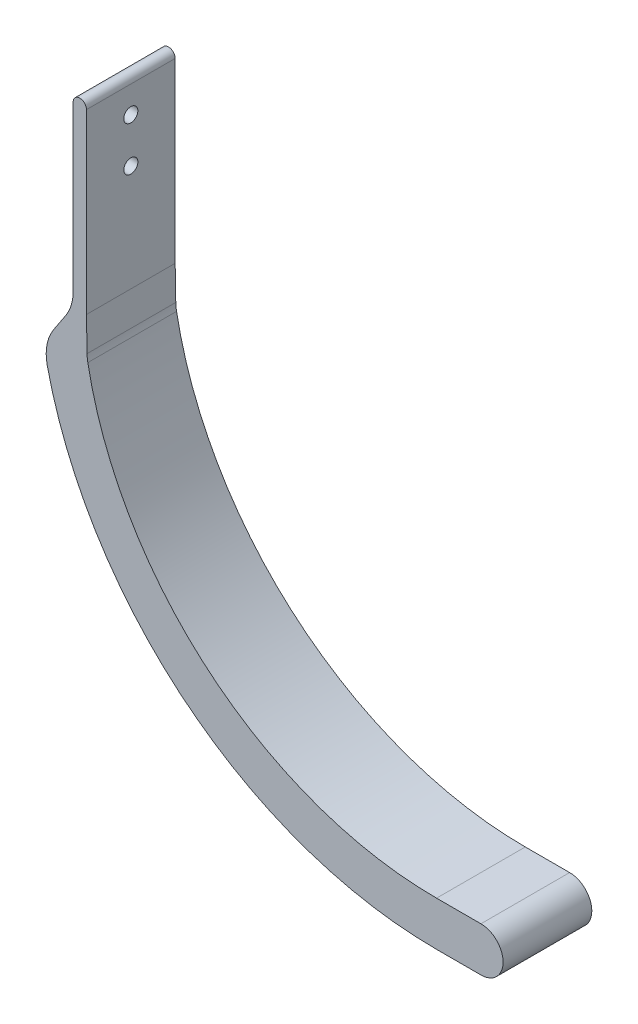
ISO-10303-21;
HEADER;
FILE_DESCRIPTION(('STEP AP214'),'2;1');
FILE_NAME('part.step','',(''),(''),'','','');
FILE_SCHEMA(('AUTOMOTIVE_DESIGN { 1 0 10303 214 1 1 1 1 }'));
ENDSEC;
DATA;
#1=APPLICATION_CONTEXT('core data for automotive mechanical design processes');
#2=APPLICATION_PROTOCOL_DEFINITION('international standard','automotive_design',2000,#1);
#3=PRODUCT_CONTEXT('',#1,'mechanical');
#4=PRODUCT('Part','Part','',(#3));
#5=PRODUCT_RELATED_PRODUCT_CATEGORY('part','',(#4));
#6=PRODUCT_DEFINITION_FORMATION('','',#4);
#7=PRODUCT_DEFINITION_CONTEXT('part definition',#1,'design');
#8=PRODUCT_DEFINITION('design','',#6,#7);
#9=PRODUCT_DEFINITION_SHAPE('','',#8);
#10=(LENGTH_UNIT() NAMED_UNIT(*) SI_UNIT(.MILLI.,.METRE.));
#11=(NAMED_UNIT(*) PLANE_ANGLE_UNIT() SI_UNIT($,.RADIAN.));
#12=(NAMED_UNIT(*) SI_UNIT($,.STERADIAN.) SOLID_ANGLE_UNIT());
#13=UNCERTAINTY_MEASURE_WITH_UNIT(LENGTH_MEASURE(1.E-05),#10,'distance_accuracy_value','');
#14=(GEOMETRIC_REPRESENTATION_CONTEXT(3) GLOBAL_UNCERTAINTY_ASSIGNED_CONTEXT((#13)) GLOBAL_UNIT_ASSIGNED_CONTEXT((#10,
#11,#12)) REPRESENTATION_CONTEXT('',''));
#15=CARTESIAN_POINT('',(0.,0.,0.));
#16=DIRECTION('',(0.,0.,1.));
#17=DIRECTION('',(1.,0.,0.));
#18=AXIS2_PLACEMENT_3D('',#15,#16,#17);
#19=CARTESIAN_POINT('',(-42.2497072792991,-138.569783033541,0.));
#20=DIRECTION('',(0.,0.,1.));
#21=DIRECTION('',(1.,0.,0.));
#22=AXIS2_PLACEMENT_3D('',#19,#20,#21);
#23=CYLINDRICAL_SURFACE('',#22,80.);
#24=CARTESIAN_POINT('',(-42.2497072792991,-138.569783033541,0.));
#25=DIRECTION('',(0.,0.,-1.));
#26=DIRECTION('',(-1.,0.,0.));
#27=AXIS2_PLACEMENT_3D('',#24,#25,#26);
#28=CIRCLE('',#27,80.);
#29=CARTESIAN_POINT('',(-42.2497072792991,-218.56978303354,0.));
#30=VERTEX_POINT('',#29);
#31=CARTESIAN_POINT('',(-120.879349349605,-153.313574536934,0.));
#32=VERTEX_POINT('',#31);
#33=EDGE_CURVE('E140',#30,#32,#28,.T.);
#34=ORIENTED_EDGE('',*,*,#33,.T.);
#35=DIRECTION('',(0.,0.,1.));
#36=VECTOR('',#35,1.);
#37=CARTESIAN_POINT('',(-120.879349349605,-153.313574536934,0.));
#38=LINE('',#37,#36);
#39=CARTESIAN_POINT('',(-120.879349349605,-153.313574536934,20.));
#40=VERTEX_POINT('',#39);
#41=EDGE_CURVE('E202',#32,#40,#38,.T.);
#42=ORIENTED_EDGE('',*,*,#41,.T.);
#43=CARTESIAN_POINT('',(-42.2497072792991,-138.569783033541,20.));
#44=DIRECTION('',(0.,0.,-1.));
#45=DIRECTION('',(-1.,0.,0.));
#46=AXIS2_PLACEMENT_3D('',#43,#44,#45);
#47=CIRCLE('',#46,80.);
#48=CARTESIAN_POINT('',(-42.2497072792991,-218.56978303354,20.));
#49=VERTEX_POINT('',#48);
#50=EDGE_CURVE('E173',#49,#40,#47,.T.);
#51=ORIENTED_EDGE('',*,*,#50,.F.);
#52=DIRECTION('',(0.,0.,1.));
#53=VECTOR('',#52,1.);
#54=CARTESIAN_POINT('',(-42.2497072792991,-218.56978303354,0.));
#55=LINE('',#54,#53);
#56=EDGE_CURVE('E200',#30,#49,#55,.T.);
#57=ORIENTED_EDGE('',*,*,#56,.F.);
#58=EDGE_LOOP('',(#34,#42,#51,#57));
#59=FACE_BOUND('',#58,.T.);
#60=ADVANCED_FACE('F33',(#59),#23,.F.);
#61=CARTESIAN_POINT('',(-32.249707279299,-218.56978303354,0.));
#62=DIRECTION('',(0.,1.,0.));
#63=DIRECTION('',(0.,0.,1.));
#64=AXIS2_PLACEMENT_3D('',#61,#62,#63);
#65=PLANE('',#64);
#66=DIRECTION('',(-1.,0.,0.));
#67=VECTOR('',#66,1.);
#68=CARTESIAN_POINT('',(-32.249707279299,-218.56978303354,20.));
#69=LINE('',#68,#67);
#70=CARTESIAN_POINT('',(-32.249707279299,-218.56978303354,20.));
#71=VERTEX_POINT('',#70);
#72=EDGE_CURVE('E197',#71,#49,#69,.T.);
#73=ORIENTED_EDGE('',*,*,#72,.F.);
#74=DIRECTION('',(0.,0.,1.));
#75=VECTOR('',#74,1.);
#76=CARTESIAN_POINT('',(-32.249707279299,-218.56978303354,0.));
#77=LINE('',#76,#75);
#78=CARTESIAN_POINT('',(-32.249707279299,-218.56978303354,0.));
#79=VERTEX_POINT('',#78);
#80=EDGE_CURVE('E203',#79,#71,#77,.T.);
#81=ORIENTED_EDGE('',*,*,#80,.F.);
#82=DIRECTION('',(-1.,0.,0.));
#83=VECTOR('',#82,1.);
#84=CARTESIAN_POINT('',(-32.249707279299,-218.56978303354,0.));
#85=LINE('',#84,#83);
#86=EDGE_CURVE('E148',#79,#30,#85,.T.);
#87=ORIENTED_EDGE('',*,*,#86,.T.);
#88=ORIENTED_EDGE('',*,*,#56,.T.);
#89=EDGE_LOOP('',(#73,#81,#87,#88));
#90=FACE_BOUND('',#89,.T.);
#91=ADVANCED_FACE('F288',(#90),#65,.T.);
#92=CARTESIAN_POINT('',(-32.249707279299,-223.56978303354,0.));
#93=DIRECTION('',(0.,0.,1.));
#94=DIRECTION('',(1.,0.,0.));
#95=AXIS2_PLACEMENT_3D('',#92,#93,#94);
#96=CYLINDRICAL_SURFACE('',#95,5.);
#97=CARTESIAN_POINT('',(-32.249707279299,-223.56978303354,20.));
#98=DIRECTION('',(0.,0.,1.));
#99=DIRECTION('',(1.,0.,0.));
#100=AXIS2_PLACEMENT_3D('',#97,#98,#99);
#101=CIRCLE('',#100,5.);
#102=CARTESIAN_POINT('',(-32.249707279299,-228.56978303354,20.));
#103=VERTEX_POINT('',#102);
#104=EDGE_CURVE('E194',#103,#71,#101,.T.);
#105=ORIENTED_EDGE('',*,*,#104,.F.);
#106=DIRECTION('',(0.,0.,1.));
#107=VECTOR('',#106,1.);
#108=CARTESIAN_POINT('',(-32.249707279299,-228.56978303354,0.));
#109=LINE('',#108,#107);
#110=CARTESIAN_POINT('',(-32.249707279299,-228.56978303354,0.));
#111=VERTEX_POINT('',#110);
#112=EDGE_CURVE('E205',#111,#103,#109,.T.);
#113=ORIENTED_EDGE('',*,*,#112,.F.);
#114=CARTESIAN_POINT('',(-32.249707279299,-223.56978303354,0.));
#115=DIRECTION('',(0.,0.,1.));
#116=DIRECTION('',(1.,0.,0.));
#117=AXIS2_PLACEMENT_3D('',#114,#115,#116);
#118=CIRCLE('',#117,5.);
#119=EDGE_CURVE('E168',#111,#79,#118,.T.);
#120=ORIENTED_EDGE('',*,*,#119,.T.);
#121=ORIENTED_EDGE('',*,*,#80,.T.);
#122=EDGE_LOOP('',(#105,#113,#120,#121));
#123=FACE_BOUND('',#122,.T.);
#124=ADVANCED_FACE('F293',(#123),#96,.T.);
#125=CARTESIAN_POINT('',(-42.2497072792991,-228.56978303354,0.));
#126=DIRECTION('',(0.,-1.,0.));
#127=DIRECTION('',(0.,0.,-1.));
#128=AXIS2_PLACEMENT_3D('',#125,#126,#127);
#129=PLANE('',#128);
#130=DIRECTION('',(1.,0.,0.));
#131=VECTOR('',#130,1.);
#132=CARTESIAN_POINT('',(-42.2497072792991,-228.56978303354,20.));
#133=LINE('',#132,#131);
#134=CARTESIAN_POINT('',(-42.2497072792991,-228.569783033541,20.));
#135=VERTEX_POINT('',#134);
#136=EDGE_CURVE('E191',#135,#103,#133,.T.);
#137=ORIENTED_EDGE('',*,*,#136,.F.);
#138=DIRECTION('',(0.,0.,1.));
#139=VECTOR('',#138,1.);
#140=CARTESIAN_POINT('',(-42.2497072792991,-228.569783033541,0.));
#141=LINE('',#140,#139);
#142=CARTESIAN_POINT('',(-42.2497072792991,-228.569783033541,0.));
#143=VERTEX_POINT('',#142);
#144=EDGE_CURVE('E207',#143,#135,#141,.T.);
#145=ORIENTED_EDGE('',*,*,#144,.F.);
#146=DIRECTION('',(1.,0.,0.));
#147=VECTOR('',#146,1.);
#148=CARTESIAN_POINT('',(-42.2497072792991,-228.56978303354,0.));
#149=LINE('',#148,#147);
#150=EDGE_CURVE('E165',#143,#111,#149,.T.);
#151=ORIENTED_EDGE('',*,*,#150,.T.);
#152=ORIENTED_EDGE('',*,*,#112,.T.);
#153=EDGE_LOOP('',(#137,#145,#151,#152));
#154=FACE_BOUND('',#153,.T.);
#155=ADVANCED_FACE('F312',(#154),#129,.T.);
#156=CARTESIAN_POINT('',(-42.2497072792991,-138.569783033541,0.));
#157=DIRECTION('',(0.,0.,1.));
#158=DIRECTION('',(1.,0.,0.));
#159=AXIS2_PLACEMENT_3D('',#156,#157,#158);
#160=CYLINDRICAL_SURFACE('',#159,90.);
#161=CARTESIAN_POINT('',(-42.2497072792991,-138.569783033541,20.));
#162=DIRECTION('',(0.,0.,1.));
#163=DIRECTION('',(1.,0.,0.));
#164=AXIS2_PLACEMENT_3D('',#161,#162,#163);
#165=CIRCLE('',#164,90.);
#166=CARTESIAN_POINT('',(-130.017899018848,-158.488229729248,20.));
#167=VERTEX_POINT('',#166);
#168=EDGE_CURVE('E189',#167,#135,#165,.T.);
#169=ORIENTED_EDGE('',*,*,#168,.F.);
#170=DIRECTION('',(0.,0.,1.));
#171=VECTOR('',#170,1.);
#172=CARTESIAN_POINT('',(-130.017899018848,-158.488229729248,0.));
#173=LINE('',#172,#171);
#174=CARTESIAN_POINT('',(-130.017899018848,-158.488229729248,0.));
#175=VERTEX_POINT('',#174);
#176=EDGE_CURVE('E54',#167,#175,#173,.F.);
#177=ORIENTED_EDGE('',*,*,#176,.T.);
#178=CARTESIAN_POINT('',(-42.2497072792991,-138.569783033541,0.));
#179=DIRECTION('',(0.,0.,1.));
#180=DIRECTION('',(1.,0.,0.));
#181=AXIS2_PLACEMENT_3D('',#178,#179,#180);
#182=CIRCLE('',#181,90.);
#183=EDGE_CURVE('E163',#175,#143,#182,.T.);
#184=ORIENTED_EDGE('',*,*,#183,.T.);
#185=ORIENTED_EDGE('',*,*,#144,.T.);
#186=EDGE_LOOP('',(#169,#177,#184,#185));
#187=FACE_BOUND('',#186,.T.);
#188=ADVANCED_FACE('F309',(#187),#160,.T.);
#189=CARTESIAN_POINT('',(-124.186249990153,-144.07769420766,0.));
#190=DIRECTION('',(-0.833977139443532,0.551798995002332,0.));
#191=DIRECTION('',(-0.551798995002332,-0.833977139443532,0.));
#192=AXIS2_PLACEMENT_3D('',#189,#190,#191);
#193=PLANE('',#192);
#194=DIRECTION('',(-0.551798995002332,-0.833977139443532,0.));
#195=VECTOR('',#194,1.);
#196=CARTESIAN_POINT('',(-124.186249990153,-144.07769420766,0.));
#197=LINE('',#196,#195);
#198=CARTESIAN_POINT('',(-125.846478595718,-146.58692803344,0.));
#199=VERTEX_POINT('',#198);
#200=CARTESIAN_POINT('',(-128.605649108889,-150.757079035258,0.));
#201=VERTEX_POINT('',#200);
#202=EDGE_CURVE('E160',#199,#201,#197,.T.);
#203=ORIENTED_EDGE('',*,*,#202,.T.);
#204=DIRECTION('',(0.,0.,1.));
#205=VECTOR('',#204,1.);
#206=CARTESIAN_POINT('',(-128.605649108889,-150.757079035258,0.));
#207=LINE('',#206,#205);
#208=CARTESIAN_POINT('',(-128.605649108889,-150.757079035258,20.));
#209=VERTEX_POINT('',#208);
#210=EDGE_CURVE('E218',#201,#209,#207,.T.);
#211=ORIENTED_EDGE('',*,*,#210,.T.);
#212=DIRECTION('',(-0.551798995002332,-0.833977139443532,0.));
#213=VECTOR('',#212,1.);
#214=CARTESIAN_POINT('',(-124.186249990153,-144.07769420766,20.));
#215=LINE('',#214,#213);
#216=CARTESIAN_POINT('',(-125.846478595718,-146.58692803344,20.));
#217=VERTEX_POINT('',#216);
#218=EDGE_CURVE('E186',#217,#209,#215,.T.);
#219=ORIENTED_EDGE('',*,*,#218,.F.);
#220=DIRECTION('',(0.,0.,1.));
#221=VECTOR('',#220,1.);
#222=CARTESIAN_POINT('',(-125.846478595718,-146.58692803344,0.));
#223=LINE('',#222,#221);
#224=EDGE_CURVE('E216',#217,#199,#223,.F.);
#225=ORIENTED_EDGE('',*,*,#224,.T.);
#226=EDGE_LOOP('',(#203,#211,#219,#225));
#227=FACE_BOUND('',#226,.T.);
#228=ADVANCED_FACE('F240',(#227),#193,.T.);
#229=CARTESIAN_POINT('',(-124.186249990154,-104.07769420766,0.));
#230=DIRECTION('',(-1.,0.,0.));
#231=DIRECTION('',(0.,-1.,0.));
#232=AXIS2_PLACEMENT_3D('',#229,#230,#231);
#233=PLANE('',#232);
#234=CARTESIAN_POINT('',(-124.186249990154,-120.07769420766,10.));
#235=DIRECTION('',(-1.,0.,0.));
#236=DIRECTION('',(0.,-1.,0.));
#237=AXIS2_PLACEMENT_3D('',#234,#235,#236);
#238=CIRCLE('',#237,1.58749999999999);
#239=CARTESIAN_POINT('',(-124.186249990154,-121.66519420766,10.));
#240=VERTEX_POINT('',#239);
#241=EDGE_CURVE('E261',#240,#240,#238,.T.);
#242=ORIENTED_EDGE('',*,*,#241,.F.);
#243=EDGE_LOOP('',(#242));
#244=FACE_BOUND('',#243,.T.);
#245=CARTESIAN_POINT('',(-124.186249990154,-110.07769420766,10.));
#246=DIRECTION('',(-1.,0.,0.));
#247=DIRECTION('',(0.,-1.,0.));
#248=AXIS2_PLACEMENT_3D('',#245,#246,#247);
#249=CIRCLE('',#248,1.58749999999999);
#250=CARTESIAN_POINT('',(-124.186249990154,-111.66519420766,10.));
#251=VERTEX_POINT('',#250);
#252=EDGE_CURVE('E177',#251,#251,#249,.T.);
#253=ORIENTED_EDGE('',*,*,#252,.F.);
#254=EDGE_LOOP('',(#253));
#255=FACE_BOUND('',#254,.T.);
#256=DIRECTION('',(0.,-1.,0.));
#257=VECTOR('',#256,1.);
#258=CARTESIAN_POINT('',(-124.186249990154,-104.07769420766,0.));
#259=LINE('',#258,#257);
#260=CARTESIAN_POINT('',(-124.186249990154,-104.07769420766,0.));
#261=VERTEX_POINT('',#260);
#262=CARTESIAN_POINT('',(-124.186249990154,-141.068938083416,0.));
#263=VERTEX_POINT('',#262);
#264=EDGE_CURVE('E155',#261,#263,#259,.T.);
#265=ORIENTED_EDGE('',*,*,#264,.T.);
#266=DIRECTION('',(0.,0.,1.));
#267=VECTOR('',#266,1.);
#268=CARTESIAN_POINT('',(-124.186249990154,-141.068938083416,20.));
#269=LINE('',#268,#267);
#270=CARTESIAN_POINT('',(-124.186249990154,-141.068938083416,20.));
#271=VERTEX_POINT('',#270);
#272=EDGE_CURVE('E226',#263,#271,#269,.T.);
#273=ORIENTED_EDGE('',*,*,#272,.T.);
#274=DIRECTION('',(0.,-1.,0.));
#275=VECTOR('',#274,1.);
#276=CARTESIAN_POINT('',(-124.186249990154,-104.07769420766,20.));
#277=LINE('',#276,#275);
#278=CARTESIAN_POINT('',(-124.186249990154,-104.07769420766,20.));
#279=VERTEX_POINT('',#278);
#280=EDGE_CURVE('E183',#279,#271,#277,.T.);
#281=ORIENTED_EDGE('',*,*,#280,.F.);
#282=DIRECTION('',(0.,0.,1.));
#283=VECTOR('',#282,1.);
#284=CARTESIAN_POINT('',(-124.186249990154,-104.07769420766,0.));
#285=LINE('',#284,#283);
#286=EDGE_CURVE('E210',#261,#279,#285,.T.);
#287=ORIENTED_EDGE('',*,*,#286,.F.);
#288=EDGE_LOOP('',(#265,#273,#281,#287));
#289=FACE_BOUND('',#288,.T.);
#290=ADVANCED_FACE('F243',(#244,#255,#289),#233,.T.);
#291=CARTESIAN_POINT('',(-122.686249990154,-104.07769420766,0.));
#292=DIRECTION('',(0.,0.,1.));
#293=DIRECTION('',(1.,0.,0.));
#294=AXIS2_PLACEMENT_3D('',#291,#292,#293);
#295=CYLINDRICAL_SURFACE('',#294,1.5);
#296=CARTESIAN_POINT('',(-122.686249990154,-104.07769420766,20.));
#297=DIRECTION('',(0.,0.,1.));
#298=DIRECTION('',(1.,0.,0.));
#299=AXIS2_PLACEMENT_3D('',#296,#297,#298);
#300=CIRCLE('',#299,1.5);
#301=CARTESIAN_POINT('',(-121.186249990154,-104.07769420766,20.));
#302=VERTEX_POINT('',#301);
#303=EDGE_CURVE('E180',#302,#279,#300,.T.);
#304=ORIENTED_EDGE('',*,*,#303,.F.);
#305=DIRECTION('',(0.,0.,1.));
#306=VECTOR('',#305,1.);
#307=CARTESIAN_POINT('',(-121.186249990154,-104.07769420766,0.));
#308=LINE('',#307,#306);
#309=CARTESIAN_POINT('',(-121.186249990154,-104.07769420766,0.));
#310=VERTEX_POINT('',#309);
#311=EDGE_CURVE('E147',#310,#302,#308,.T.);
#312=ORIENTED_EDGE('',*,*,#311,.F.);
#313=CARTESIAN_POINT('',(-122.686249990154,-104.07769420766,0.));
#314=DIRECTION('',(0.,0.,1.));
#315=DIRECTION('',(1.,0.,0.));
#316=AXIS2_PLACEMENT_3D('',#313,#314,#315);
#317=CIRCLE('',#316,1.5);
#318=EDGE_CURVE('E153',#310,#261,#317,.T.);
#319=ORIENTED_EDGE('',*,*,#318,.T.);
#320=ORIENTED_EDGE('',*,*,#286,.T.);
#321=EDGE_LOOP('',(#304,#312,#319,#320));
#322=FACE_BOUND('',#321,.T.);
#323=ADVANCED_FACE('F246',(#322),#295,.T.);
#324=CARTESIAN_POINT('',(-121.186249990154,-144.07769420766,0.));
#325=DIRECTION('',(1.,0.,0.));
#326=DIRECTION('',(0.,1.,0.));
#327=AXIS2_PLACEMENT_3D('',#324,#325,#326);
#328=PLANE('',#327);
#329=CARTESIAN_POINT('',(-121.186249990154,-120.07769420766,10.));
#330=DIRECTION('',(1.,0.,0.));
#331=DIRECTION('',(0.,0.,-1.));
#332=AXIS2_PLACEMENT_3D('',#329,#330,#331);
#333=CIRCLE('',#332,1.58749999999999);
#334=CARTESIAN_POINT('',(-121.186249990154,-120.07769420766,8.41250000000001));
#335=VERTEX_POINT('',#334);
#336=EDGE_CURVE('E264',#335,#335,#333,.T.);
#337=ORIENTED_EDGE('',*,*,#336,.F.);
#338=EDGE_LOOP('',(#337));
#339=FACE_BOUND('',#338,.T.);
#340=CARTESIAN_POINT('',(-121.186249990154,-110.07769420766,10.));
#341=DIRECTION('',(1.,0.,0.));
#342=DIRECTION('',(0.,0.,-1.));
#343=AXIS2_PLACEMENT_3D('',#340,#341,#342);
#344=CIRCLE('',#343,1.58749999999999);
#345=CARTESIAN_POINT('',(-121.186249990154,-110.07769420766,8.41250000000001));
#346=VERTEX_POINT('',#345);
#347=EDGE_CURVE('E258',#346,#346,#344,.T.);
#348=ORIENTED_EDGE('',*,*,#347,.F.);
#349=EDGE_LOOP('',(#348));
#350=FACE_BOUND('',#349,.T.);
#351=DIRECTION('',(0.,1.,0.));
#352=VECTOR('',#351,1.);
#353=CARTESIAN_POINT('',(-121.186249990154,-144.07769420766,20.));
#354=LINE('',#353,#352);
#355=CARTESIAN_POINT('',(-121.186249990154,-144.07769420766,20.));
#356=VERTEX_POINT('',#355);
#357=EDGE_CURVE('E146',#356,#302,#354,.T.);
#358=ORIENTED_EDGE('',*,*,#357,.F.);
#359=DIRECTION('',(0.,0.,1.));
#360=VECTOR('',#359,1.);
#361=CARTESIAN_POINT('',(-121.186249990154,-144.07769420766,0.));
#362=LINE('',#361,#360);
#363=CARTESIAN_POINT('',(-121.186249990154,-144.07769420766,0.));
#364=VERTEX_POINT('',#363);
#365=EDGE_CURVE('E133',#364,#356,#362,.T.);
#366=ORIENTED_EDGE('',*,*,#365,.F.);
#367=DIRECTION('',(0.,1.,0.));
#368=VECTOR('',#367,1.);
#369=CARTESIAN_POINT('',(-121.186249990154,-144.07769420766,0.));
#370=LINE('',#369,#368);
#371=EDGE_CURVE('E139',#364,#310,#370,.T.);
#372=ORIENTED_EDGE('',*,*,#371,.T.);
#373=ORIENTED_EDGE('',*,*,#311,.T.);
#374=EDGE_LOOP('',(#358,#366,#372,#373));
#375=FACE_BOUND('',#374,.T.);
#376=ADVANCED_FACE('F144',(#339,#350,#375),#328,.T.);
#377=CARTESIAN_POINT('',(-121.034327520276,-152.461637246895,0.));
#378=DIRECTION('',(0.999835861502363,0.0181176724175101,0.));
#379=DIRECTION('',(-0.0181176724175101,0.999835861502363,0.));
#380=AXIS2_PLACEMENT_3D('',#377,#378,#379);
#381=PLANE('',#380);
#382=DIRECTION('',(-0.0181176724175101,0.999835861502363,0.));
#383=VECTOR('',#382,1.);
#384=CARTESIAN_POINT('',(-121.034327520276,-152.461637246895,20.));
#385=LINE('',#384,#383);
#386=CARTESIAN_POINT('',(-121.04900270584,-151.651777323185,20.));
#387=VERTEX_POINT('',#386);
#388=EDGE_CURVE('E176',#387,#356,#385,.T.);
#389=ORIENTED_EDGE('',*,*,#388,.F.);
#390=DIRECTION('',(0.,0.,-1.));
#391=VECTOR('',#390,1.);
#392=CARTESIAN_POINT('',(-121.04900270584,-151.651777323185,0.));
#393=LINE('',#392,#391);
#394=CARTESIAN_POINT('',(-121.04900270584,-151.651777323185,0.));
#395=VERTEX_POINT('',#394);
#396=EDGE_CURVE('E136',#387,#395,#393,.T.);
#397=ORIENTED_EDGE('',*,*,#396,.T.);
#398=DIRECTION('',(-0.0181176724175101,0.999835861502363,0.));
#399=VECTOR('',#398,1.);
#400=CARTESIAN_POINT('',(-121.034327520276,-152.461637246895,0.));
#401=LINE('',#400,#399);
#402=EDGE_CURVE('E129',#395,#364,#401,.T.);
#403=ORIENTED_EDGE('',*,*,#402,.T.);
#404=ORIENTED_EDGE('',*,*,#365,.T.);
#405=EDGE_LOOP('',(#389,#397,#403,#404));
#406=FACE_BOUND('',#405,.T.);
#407=ADVANCED_FACE('F132',(#406),#381,.T.);
#408=CARTESIAN_POINT('',(-42.2497072792991,-138.569783033541,0.));
#409=DIRECTION('',(0.,0.,-1.));
#410=DIRECTION('',(-1.,0.,0.));
#411=AXIS2_PLACEMENT_3D('',#408,#409,#410);
#412=PLANE('',#411);
#413=ORIENTED_EDGE('',*,*,#183,.F.);
#414=CARTESIAN_POINT('',(-120.265877714454,-156.275068985281,0.));
#415=DIRECTION('',(0.,0.,-1.));
#416=DIRECTION('',(-1.,0.,0.));
#417=AXIS2_PLACEMENT_3D('',#414,#415,#416);
#418=CIRCLE('',#417,10.);
#419=EDGE_CURVE('E224',#175,#201,#418,.T.);
#420=ORIENTED_EDGE('',*,*,#419,.T.);
#421=ORIENTED_EDGE('',*,*,#202,.F.);
#422=CARTESIAN_POINT('',(-134.186249990153,-141.068938083416,0.));
#423=DIRECTION('',(0.,0.,-1.));
#424=DIRECTION('',(-1.,0.,0.));
#425=AXIS2_PLACEMENT_3D('',#422,#423,#424);
#426=CIRCLE('',#425,10.);
#427=EDGE_CURVE('E11',#199,#263,#426,.F.);
#428=ORIENTED_EDGE('',*,*,#427,.T.);
#429=ORIENTED_EDGE('',*,*,#264,.F.);
#430=ORIENTED_EDGE('',*,*,#318,.F.);
#431=ORIENTED_EDGE('',*,*,#371,.F.);
#432=ORIENTED_EDGE('',*,*,#402,.F.);
#433=CARTESIAN_POINT('',(-111.050644090817,-151.47060059901,0.));
#434=DIRECTION('',(0.,0.,-1.));
#435=DIRECTION('',(-1.,0.,0.));
#436=AXIS2_PLACEMENT_3D('',#433,#434,#435);
#437=CIRCLE('',#436,10.);
#438=EDGE_CURVE('E231',#395,#32,#437,.F.);
#439=ORIENTED_EDGE('',*,*,#438,.T.);
#440=ORIENTED_EDGE('',*,*,#33,.F.);
#441=ORIENTED_EDGE('',*,*,#86,.F.);
#442=ORIENTED_EDGE('',*,*,#119,.F.);
#443=ORIENTED_EDGE('',*,*,#150,.F.);
#444=EDGE_LOOP('',(#413,#420,#421,#428,#429,#430,#431,#432,#439,#440,#441,#442,#443));
#445=FACE_BOUND('',#444,.T.);
#446=ADVANCED_FACE('F151',(#445),#412,.T.);
#447=CARTESIAN_POINT('',(-42.2497072792991,-138.569783033541,20.));
#448=DIRECTION('',(0.,0.,-1.));
#449=DIRECTION('',(-1.,0.,0.));
#450=AXIS2_PLACEMENT_3D('',#447,#448,#449);
#451=PLANE('',#450);
#452=ORIENTED_EDGE('',*,*,#218,.T.);
#453=CARTESIAN_POINT('',(-120.265877714454,-156.275068985281,20.));
#454=DIRECTION('',(0.,0.,-1.));
#455=DIRECTION('',(-1.,0.,0.));
#456=AXIS2_PLACEMENT_3D('',#453,#454,#455);
#457=CIRCLE('',#456,10.);
#458=EDGE_CURVE('E221',#209,#167,#457,.F.);
#459=ORIENTED_EDGE('',*,*,#458,.T.);
#460=ORIENTED_EDGE('',*,*,#168,.T.);
#461=ORIENTED_EDGE('',*,*,#136,.T.);
#462=ORIENTED_EDGE('',*,*,#104,.T.);
#463=ORIENTED_EDGE('',*,*,#72,.T.);
#464=ORIENTED_EDGE('',*,*,#50,.T.);
#465=CARTESIAN_POINT('',(-111.050644090817,-151.47060059901,20.));
#466=DIRECTION('',(0.,0.,-1.));
#467=DIRECTION('',(-1.,0.,0.));
#468=AXIS2_PLACEMENT_3D('',#465,#466,#467);
#469=CIRCLE('',#468,10.);
#470=EDGE_CURVE('E229',#40,#387,#469,.T.);
#471=ORIENTED_EDGE('',*,*,#470,.T.);
#472=ORIENTED_EDGE('',*,*,#388,.T.);
#473=ORIENTED_EDGE('',*,*,#357,.T.);
#474=ORIENTED_EDGE('',*,*,#303,.T.);
#475=ORIENTED_EDGE('',*,*,#280,.T.);
#476=CARTESIAN_POINT('',(-134.186249990153,-141.068938083416,20.));
#477=DIRECTION('',(0.,0.,-1.));
#478=DIRECTION('',(-1.,0.,0.));
#479=AXIS2_PLACEMENT_3D('',#476,#477,#478);
#480=CIRCLE('',#479,10.);
#481=EDGE_CURVE('E41',#271,#217,#480,.T.);
#482=ORIENTED_EDGE('',*,*,#481,.T.);
#483=EDGE_LOOP('',(#452,#459,#460,#461,#462,#463,#464,#471,#472,#473,#474,#475,#482));
#484=FACE_BOUND('',#483,.T.);
#485=ADVANCED_FACE('F234',(#484),#451,.F.);
#486=CARTESIAN_POINT('',(-121.186249990154,-110.07769420766,10.));
#487=DIRECTION('',(1.,0.,0.));
#488=DIRECTION('',(0.,0.,-1.));
#489=AXIS2_PLACEMENT_3D('',#486,#487,#488);
#490=CYLINDRICAL_SURFACE('',#489,1.58749999999999);
#491=ORIENTED_EDGE('',*,*,#252,.T.);
#492=EDGE_LOOP('',(#491));
#493=FACE_BOUND('',#492,.T.);
#494=ORIENTED_EDGE('',*,*,#347,.T.);
#495=EDGE_LOOP('',(#494));
#496=FACE_BOUND('',#495,.T.);
#497=ADVANCED_FACE('F275',(#493,#496),#490,.F.);
#498=CARTESIAN_POINT('',(-121.186249990154,-120.07769420766,10.));
#499=DIRECTION('',(1.,0.,0.));
#500=DIRECTION('',(0.,0.,-1.));
#501=AXIS2_PLACEMENT_3D('',#498,#499,#500);
#502=CYLINDRICAL_SURFACE('',#501,1.58749999999999);
#503=ORIENTED_EDGE('',*,*,#241,.T.);
#504=EDGE_LOOP('',(#503));
#505=FACE_BOUND('',#504,.T.);
#506=ORIENTED_EDGE('',*,*,#336,.T.);
#507=EDGE_LOOP('',(#506));
#508=FACE_BOUND('',#507,.T.);
#509=ADVANCED_FACE('F268',(#505,#508),#502,.F.);
#510=CARTESIAN_POINT('',(-111.050644090817,-151.47060059901,0.));
#511=DIRECTION('',(0.,0.,1.));
#512=DIRECTION('',(1.,0.,0.));
#513=AXIS2_PLACEMENT_3D('',#510,#511,#512);
#514=CYLINDRICAL_SURFACE('',#513,10.);
#515=ORIENTED_EDGE('',*,*,#438,.F.);
#516=ORIENTED_EDGE('',*,*,#396,.F.);
#517=ORIENTED_EDGE('',*,*,#470,.F.);
#518=ORIENTED_EDGE('',*,*,#41,.F.);
#519=EDGE_LOOP('',(#515,#516,#517,#518));
#520=FACE_BOUND('',#519,.T.);
#521=ADVANCED_FACE('F248',(#520),#514,.F.);
#522=CARTESIAN_POINT('',(-120.265877714454,-156.275068985281,0.));
#523=DIRECTION('',(0.,0.,1.));
#524=DIRECTION('',(1.,0.,0.));
#525=AXIS2_PLACEMENT_3D('',#522,#523,#524);
#526=CYLINDRICAL_SURFACE('',#525,10.);
#527=ORIENTED_EDGE('',*,*,#419,.F.);
#528=ORIENTED_EDGE('',*,*,#176,.F.);
#529=ORIENTED_EDGE('',*,*,#458,.F.);
#530=ORIENTED_EDGE('',*,*,#210,.F.);
#531=EDGE_LOOP('',(#527,#528,#529,#530));
#532=FACE_BOUND('',#531,.T.);
#533=ADVANCED_FACE('F299',(#532),#526,.T.);
#534=CARTESIAN_POINT('',(-134.186249990153,-141.068938083416,0.));
#535=DIRECTION('',(0.,0.,-1.));
#536=DIRECTION('',(-1.,0.,0.));
#537=AXIS2_PLACEMENT_3D('',#534,#535,#536);
#538=CYLINDRICAL_SURFACE('',#537,10.);
#539=ORIENTED_EDGE('',*,*,#427,.F.);
#540=ORIENTED_EDGE('',*,*,#224,.F.);
#541=ORIENTED_EDGE('',*,*,#481,.F.);
#542=ORIENTED_EDGE('',*,*,#272,.F.);
#543=EDGE_LOOP('',(#539,#540,#541,#542));
#544=FACE_BOUND('',#543,.T.);
#545=ADVANCED_FACE('F35',(#544),#538,.F.);
#546=CLOSED_SHELL('',(#60,#91,#124,#155,#188,#228,#290,#323,#376,#407,#446,#485,#497,#509,#521,
#533,#545));
#547=MANIFOLD_SOLID_BREP('B2',#546);
#548=ADVANCED_BREP_SHAPE_REPRESENTATION('',(#18,#547),#14);
#549=SHAPE_DEFINITION_REPRESENTATION(#9,#548);
ENDSEC;
END-ISO-10303-21;
